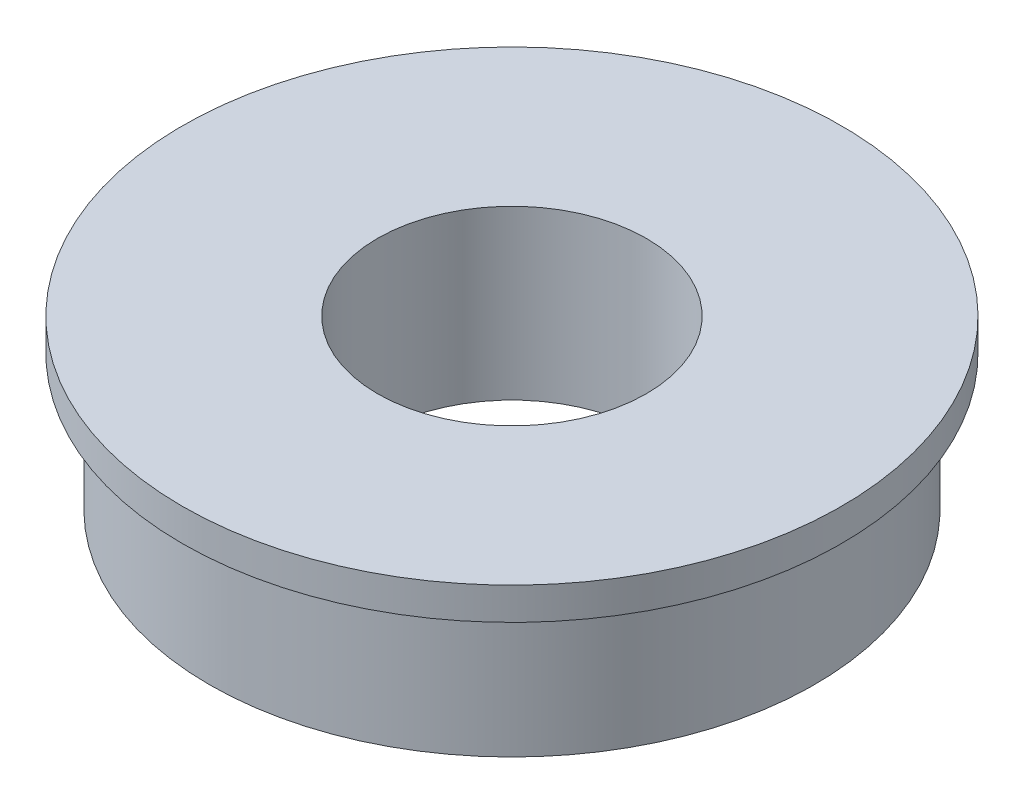
ISO-10303-21;
HEADER;
FILE_DESCRIPTION(('STEP AP214'),'2;1');
FILE_NAME('part.step','',(''),(''),'','','');
FILE_SCHEMA(('AUTOMOTIVE_DESIGN { 1 0 10303 214 1 1 1 1 }'));
ENDSEC;
DATA;
#1=APPLICATION_CONTEXT('core data for automotive mechanical design processes');
#2=APPLICATION_PROTOCOL_DEFINITION('international standard','automotive_design',2000,#1);
#3=PRODUCT_CONTEXT('',#1,'mechanical');
#4=PRODUCT('Part','Part','',(#3));
#5=PRODUCT_RELATED_PRODUCT_CATEGORY('part','',(#4));
#6=PRODUCT_DEFINITION_FORMATION('','',#4);
#7=PRODUCT_DEFINITION_CONTEXT('part definition',#1,'design');
#8=PRODUCT_DEFINITION('design','',#6,#7);
#9=PRODUCT_DEFINITION_SHAPE('','',#8);
#10=(LENGTH_UNIT() NAMED_UNIT(*) SI_UNIT(.MILLI.,.METRE.));
#11=(NAMED_UNIT(*) PLANE_ANGLE_UNIT() SI_UNIT($,.RADIAN.));
#12=(NAMED_UNIT(*) SI_UNIT($,.STERADIAN.) SOLID_ANGLE_UNIT());
#13=UNCERTAINTY_MEASURE_WITH_UNIT(LENGTH_MEASURE(1.E-05),#10,'distance_accuracy_value','');
#14=(GEOMETRIC_REPRESENTATION_CONTEXT(3) GLOBAL_UNCERTAINTY_ASSIGNED_CONTEXT((#13)) GLOBAL_UNIT_ASSIGNED_CONTEXT((#10,
#11,#12)) REPRESENTATION_CONTEXT('',''));
#15=CARTESIAN_POINT('',(0.,0.,0.));
#16=DIRECTION('',(0.,0.,1.));
#17=DIRECTION('',(1.,0.,0.));
#18=AXIS2_PLACEMENT_3D('',#15,#16,#17);
#19=CARTESIAN_POINT('',(0.,7.9248,0.));
#20=DIRECTION('',(0.,-1.,0.));
#21=DIRECTION('',(0.,0.,-1.));
#22=AXIS2_PLACEMENT_3D('',#19,#20,#21);
#23=CYLINDRICAL_SURFACE('',#22,14.2875);
#24=CARTESIAN_POINT('',(0.,0.,0.));
#25=DIRECTION('',(0.,1.,0.));
#26=DIRECTION('',(0.,0.,1.));
#27=AXIS2_PLACEMENT_3D('',#24,#25,#26);
#28=CIRCLE('',#27,14.2875);
#29=CARTESIAN_POINT('',(0.,0.,14.2875));
#30=VERTEX_POINT('',#29);
#31=EDGE_CURVE('E37',#30,#30,#28,.T.);
#32=ORIENTED_EDGE('',*,*,#31,.T.);
#33=EDGE_LOOP('',(#32));
#34=FACE_BOUND('',#33,.T.);
#35=CARTESIAN_POINT('',(0.,6.4008,0.));
#36=DIRECTION('',(0.,1.,0.));
#37=DIRECTION('',(0.,0.,1.));
#38=AXIS2_PLACEMENT_3D('',#35,#36,#37);
#39=CIRCLE('',#38,14.2875);
#40=CARTESIAN_POINT('',(0.,6.4008,14.2875));
#41=VERTEX_POINT('',#40);
#42=EDGE_CURVE('E10',#41,#41,#39,.T.);
#43=ORIENTED_EDGE('',*,*,#42,.F.);
#44=EDGE_LOOP('',(#43));
#45=FACE_BOUND('',#44,.T.);
#46=ADVANCED_FACE('F31',(#34,#45),#23,.T.);
#47=CARTESIAN_POINT('',(0.,0.,0.));
#48=DIRECTION('',(0.,1.,0.));
#49=DIRECTION('',(0.,0.,1.));
#50=AXIS2_PLACEMENT_3D('',#47,#48,#49);
#51=PLANE('',#50);
#52=CARTESIAN_POINT('',(0.,0.,0.));
#53=DIRECTION('',(0.,1.,0.));
#54=DIRECTION('',(0.,0.,1.));
#55=AXIS2_PLACEMENT_3D('',#52,#53,#54);
#56=CIRCLE('',#55,6.35);
#57=CARTESIAN_POINT('',(0.,0.,6.35));
#58=VERTEX_POINT('',#57);
#59=EDGE_CURVE('E49',#58,#58,#56,.T.);
#60=ORIENTED_EDGE('',*,*,#59,.T.);
#61=EDGE_LOOP('',(#60));
#62=FACE_BOUND('',#61,.T.);
#63=ORIENTED_EDGE('',*,*,#31,.F.);
#64=EDGE_LOOP('',(#63));
#65=FACE_BOUND('',#64,.T.);
#66=ADVANCED_FACE('F57',(#62,#65),#51,.F.);
#67=CARTESIAN_POINT('',(0.,6.4008,0.));
#68=DIRECTION('',(0.,1.,0.));
#69=DIRECTION('',(0.,0.,1.));
#70=AXIS2_PLACEMENT_3D('',#67,#68,#69);
#71=CYLINDRICAL_SURFACE('',#70,15.5575);
#72=CARTESIAN_POINT('',(0.,6.4008,0.));
#73=DIRECTION('',(0.,1.,0.));
#74=DIRECTION('',(0.,0.,1.));
#75=AXIS2_PLACEMENT_3D('',#72,#73,#74);
#76=CIRCLE('',#75,15.5575);
#77=CARTESIAN_POINT('',(0.,6.4008,15.5575));
#78=VERTEX_POINT('',#77);
#79=EDGE_CURVE('E41',#78,#78,#76,.T.);
#80=CARTESIAN_POINT('',(0.,7.9248,0.));
#81=DIRECTION('',(0.,1.,0.));
#82=DIRECTION('',(0.,0.,1.));
#83=AXIS2_PLACEMENT_3D('',#80,#81,#82);
#84=CIRCLE('',#83,15.5575);
#85=CARTESIAN_POINT('',(0.,7.9248,15.5575));
#86=VERTEX_POINT('',#85);
#87=EDGE_CURVE('E45',#86,#86,#84,.T.);
#88=CARTESIAN_POINT('',(0.,6.4008,15.5575));
#89=CARTESIAN_POINT('',(0.,6.416675,15.5575));
#90=CARTESIAN_POINT('',(0.,6.43255,15.5575));
#91=CARTESIAN_POINT('',(0.,6.4643,15.5575));
#92=CARTESIAN_POINT('',(0.,6.480175,15.5575));
#93=CARTESIAN_POINT('',(0.,6.511925,15.5575));
#94=CARTESIAN_POINT('',(0.,6.5278,15.5575));
#95=CARTESIAN_POINT('',(0.,6.55955,15.5575));
#96=CARTESIAN_POINT('',(0.,6.575425,15.5575));
#97=CARTESIAN_POINT('',(0.,6.607175,15.5575));
#98=CARTESIAN_POINT('',(0.,6.62305,15.5575));
#99=CARTESIAN_POINT('',(0.,6.6548,15.5575));
#100=CARTESIAN_POINT('',(0.,6.670675,15.5575));
#101=CARTESIAN_POINT('',(0.,6.702425,15.5575));
#102=CARTESIAN_POINT('',(0.,6.7183,15.5575));
#103=CARTESIAN_POINT('',(0.,6.75005,15.5575));
#104=CARTESIAN_POINT('',(0.,6.765925,15.5575));
#105=CARTESIAN_POINT('',(0.,6.797675,15.5575));
#106=CARTESIAN_POINT('',(0.,6.81355,15.5575));
#107=CARTESIAN_POINT('',(0.,6.8453,15.5575));
#108=CARTESIAN_POINT('',(0.,6.861175,15.5575));
#109=CARTESIAN_POINT('',(0.,6.892925,15.5575));
#110=CARTESIAN_POINT('',(0.,6.9088,15.5575));
#111=CARTESIAN_POINT('',(0.,6.94055,15.5575));
#112=CARTESIAN_POINT('',(0.,6.956425,15.5575));
#113=CARTESIAN_POINT('',(0.,6.988175,15.5575));
#114=CARTESIAN_POINT('',(0.,7.00405,15.5575));
#115=CARTESIAN_POINT('',(0.,7.0358,15.5575));
#116=CARTESIAN_POINT('',(0.,7.051675,15.5575));
#117=CARTESIAN_POINT('',(0.,7.083425,15.5575));
#118=CARTESIAN_POINT('',(0.,7.0993,15.5575));
#119=CARTESIAN_POINT('',(0.,7.13105,15.5575));
#120=CARTESIAN_POINT('',(0.,7.146925,15.5575));
#121=CARTESIAN_POINT('',(0.,7.178675,15.5575));
#122=CARTESIAN_POINT('',(0.,7.19455,15.5575));
#123=CARTESIAN_POINT('',(0.,7.2263,15.5575));
#124=CARTESIAN_POINT('',(0.,7.242175,15.5575));
#125=CARTESIAN_POINT('',(0.,7.273925,15.5575));
#126=CARTESIAN_POINT('',(0.,7.2898,15.5575));
#127=CARTESIAN_POINT('',(0.,7.32155,15.5575));
#128=CARTESIAN_POINT('',(0.,7.337425,15.5575));
#129=CARTESIAN_POINT('',(0.,7.369175,15.5575));
#130=CARTESIAN_POINT('',(0.,7.38505,15.5575));
#131=CARTESIAN_POINT('',(0.,7.4168,15.5575));
#132=CARTESIAN_POINT('',(0.,7.432675,15.5575));
#133=CARTESIAN_POINT('',(0.,7.464425,15.5575));
#134=CARTESIAN_POINT('',(0.,7.4803,15.5575));
#135=CARTESIAN_POINT('',(0.,7.51205,15.5575));
#136=CARTESIAN_POINT('',(0.,7.527925,15.5575));
#137=CARTESIAN_POINT('',(0.,7.559675,15.5575));
#138=CARTESIAN_POINT('',(0.,7.57555,15.5575));
#139=CARTESIAN_POINT('',(0.,7.6073,15.5575));
#140=CARTESIAN_POINT('',(0.,7.623175,15.5575));
#141=CARTESIAN_POINT('',(0.,7.654925,15.5575));
#142=CARTESIAN_POINT('',(0.,7.6708,15.5575));
#143=CARTESIAN_POINT('',(0.,7.70255,15.5575));
#144=CARTESIAN_POINT('',(0.,7.718425,15.5575));
#145=CARTESIAN_POINT('',(0.,7.750175,15.5575));
#146=CARTESIAN_POINT('',(0.,7.76605,15.5575));
#147=CARTESIAN_POINT('',(0.,7.7978,15.5575));
#148=CARTESIAN_POINT('',(0.,7.813675,15.5575));
#149=CARTESIAN_POINT('',(0.,7.845425,15.5575));
#150=CARTESIAN_POINT('',(0.,7.8613,15.5575));
#151=CARTESIAN_POINT('',(0.,7.89305,15.5575));
#152=CARTESIAN_POINT('',(0.,7.908925,15.5575));
#153=CARTESIAN_POINT('',(0.,7.9248,15.5575));
#154=B_SPLINE_CURVE_WITH_KNOTS('',3,(#88,#89,#90,#91,#92,#93,#94,#95,#96,#97,#98,#99,#100,#101,
#102,#103,#104,#105,#106,#107,#108,#109,#110,#111,#112,#113,#114,#115,#116,#117,#118,#119,#120,
#121,#122,#123,#124,#125,#126,#127,#128,#129,#130,#131,#132,#133,#134,#135,#136,#137,#138,#139,
#140,#141,#142,#143,#144,#145,#146,#147,#148,#149,#150,#151,#152,#153),.UNSPECIFIED.,.F.,.F.,(4,
2,2,2,2,2,2,2,2,2,2,2,2,2,2,2,2,2,2,2,2,2,2,2,2,2,2,2,2,2,2,2,4),(0.,0.0476249999999999,
0.0952499999999998,0.142875,0.1905,0.238125,0.28575,0.333374999999999,0.380999999999999,
0.428624999999999,0.476249999999999,0.523874999999999,0.571499999999999,0.619124999999999,
0.66675,0.714374999999999,0.762,0.809625,0.85725,0.904874999999999,0.952499999999999,1.000125,
1.04775,1.095375,1.143,1.190625,1.23825,1.285875,1.3335,1.381125,1.42875,1.476375,1.524),.UNSPECIFIED.);
#155=EDGE_CURVE('BSEAM73',#78,#86,#154,.T.);
#156=ORIENTED_EDGE('',*,*,#79,.T.);
#157=ORIENTED_EDGE('',*,*,#87,.F.);
#158=ORIENTED_EDGE('',*,*,#155,.T.);
#159=ORIENTED_EDGE('',*,*,#155,.F.);
#160=EDGE_LOOP('',(#156,#158,#157,#159));
#161=FACE_BOUND('',#160,.T.);
#162=ADVANCED_FACE('F73',(#161),#71,.T.);
#163=CARTESIAN_POINT('',(0.,6.4008,0.));
#164=DIRECTION('',(0.,1.,0.));
#165=DIRECTION('',(0.,0.,1.));
#166=AXIS2_PLACEMENT_3D('',#163,#164,#165);
#167=PLANE('',#166);
#168=ORIENTED_EDGE('',*,*,#42,.T.);
#169=EDGE_LOOP('',(#168));
#170=FACE_BOUND('',#169,.T.);
#171=ORIENTED_EDGE('',*,*,#79,.F.);
#172=EDGE_LOOP('',(#171));
#173=FACE_BOUND('',#172,.T.);
#174=ADVANCED_FACE('F69',(#170,#173),#167,.F.);
#175=CARTESIAN_POINT('',(0.,7.9248,0.));
#176=DIRECTION('',(0.,1.,0.));
#177=DIRECTION('',(0.,0.,1.));
#178=AXIS2_PLACEMENT_3D('',#175,#176,#177);
#179=PLANE('',#178);
#180=CARTESIAN_POINT('',(0.,7.9248,0.));
#181=DIRECTION('',(0.,1.,0.));
#182=DIRECTION('',(0.,0.,1.));
#183=AXIS2_PLACEMENT_3D('',#180,#181,#182);
#184=CIRCLE('',#183,6.35);
#185=CARTESIAN_POINT('',(0.,7.9248,6.35));
#186=VERTEX_POINT('',#185);
#187=EDGE_CURVE('E51',#186,#186,#184,.T.);
#188=ORIENTED_EDGE('',*,*,#187,.F.);
#189=EDGE_LOOP('',(#188));
#190=FACE_BOUND('',#189,.T.);
#191=ORIENTED_EDGE('',*,*,#87,.T.);
#192=EDGE_LOOP('',(#191));
#193=FACE_BOUND('',#192,.T.);
#194=ADVANCED_FACE('F63',(#190,#193),#179,.T.);
#195=CARTESIAN_POINT('',(0.,0.,0.));
#196=DIRECTION('',(0.,1.,0.));
#197=DIRECTION('',(0.,0.,1.));
#198=AXIS2_PLACEMENT_3D('',#195,#196,#197);
#199=CYLINDRICAL_SURFACE('',#198,6.35);
#200=ORIENTED_EDGE('',*,*,#59,.F.);
#201=EDGE_LOOP('',(#200));
#202=FACE_BOUND('',#201,.T.);
#203=ORIENTED_EDGE('',*,*,#187,.T.);
#204=EDGE_LOOP('',(#203));
#205=FACE_BOUND('',#204,.T.);
#206=ADVANCED_FACE('F60',(#202,#205),#199,.F.);
#207=CLOSED_SHELL('',(#46,#66,#162,#174,#194,#206));
#208=MANIFOLD_SOLID_BREP('B2',#207);
#209=ADVANCED_BREP_SHAPE_REPRESENTATION('',(#18,#208),#14);
#210=SHAPE_DEFINITION_REPRESENTATION(#9,#209);
ENDSEC;
END-ISO-10303-21;
